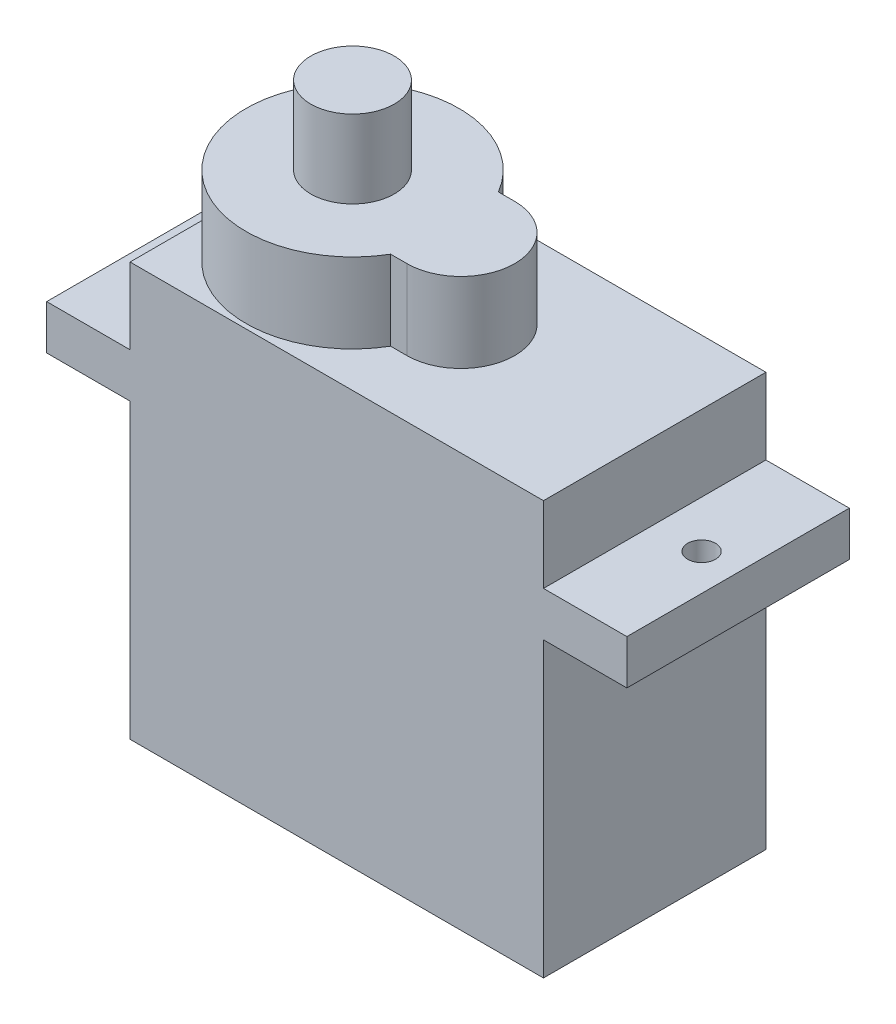
ISO-10303-21;
HEADER;
FILE_DESCRIPTION(('STEP AP214'),'2;1');
FILE_NAME('part.step','',(''),(''),'','','');
FILE_SCHEMA(('AUTOMOTIVE_DESIGN { 1 0 10303 214 1 1 1 1 }'));
ENDSEC;
DATA;
#1=APPLICATION_CONTEXT('core data for automotive mechanical design processes');
#2=APPLICATION_PROTOCOL_DEFINITION('international standard','automotive_design',2000,#1);
#3=PRODUCT_CONTEXT('',#1,'mechanical');
#4=PRODUCT('Part','Part','',(#3));
#5=PRODUCT_RELATED_PRODUCT_CATEGORY('part','',(#4));
#6=PRODUCT_DEFINITION_FORMATION('','',#4);
#7=PRODUCT_DEFINITION_CONTEXT('part definition',#1,'design');
#8=PRODUCT_DEFINITION('design','',#6,#7);
#9=PRODUCT_DEFINITION_SHAPE('','',#8);
#10=(LENGTH_UNIT() NAMED_UNIT(*) SI_UNIT(.MILLI.,.METRE.));
#11=(NAMED_UNIT(*) PLANE_ANGLE_UNIT() SI_UNIT($,.RADIAN.));
#12=(NAMED_UNIT(*) SI_UNIT($,.STERADIAN.) SOLID_ANGLE_UNIT());
#13=UNCERTAINTY_MEASURE_WITH_UNIT(LENGTH_MEASURE(1.E-05),#10,'distance_accuracy_value','');
#14=(GEOMETRIC_REPRESENTATION_CONTEXT(3) GLOBAL_UNCERTAINTY_ASSIGNED_CONTEXT((#13)) GLOBAL_UNIT_ASSIGNED_CONTEXT((#10,
#11,#12)) REPRESENTATION_CONTEXT('',''));
#15=CARTESIAN_POINT('',(0.,0.,0.));
#16=DIRECTION('',(0.,0.,1.));
#17=DIRECTION('',(1.,0.,0.));
#18=AXIS2_PLACEMENT_3D('',#15,#16,#17);
#19=CARTESIAN_POINT('',(11.15,22.3,-6.));
#20=DIRECTION('',(-1.,0.,0.));
#21=DIRECTION('',(0.,0.,1.));
#22=AXIS2_PLACEMENT_3D('',#19,#20,#21);
#23=PLANE('',#22);
#24=DIRECTION('',(0.,-1.,0.));
#25=VECTOR('',#24,1.);
#26=CARTESIAN_POINT('',(11.15,22.3,-6.));
#27=LINE('',#26,#25);
#28=CARTESIAN_POINT('',(11.15,15.8,-6.));
#29=VERTEX_POINT('',#28);
#30=CARTESIAN_POINT('',(11.15,0.,-6.));
#31=VERTEX_POINT('',#30);
#32=EDGE_CURVE('E256',#29,#31,#27,.T.);
#33=ORIENTED_EDGE('',*,*,#32,.F.);
#34=DIRECTION('',(0.,0.,1.));
#35=VECTOR('',#34,1.);
#36=CARTESIAN_POINT('',(11.15,15.8,-6.));
#37=LINE('',#36,#35);
#38=CARTESIAN_POINT('',(11.15,15.8,6.));
#39=VERTEX_POINT('',#38);
#40=EDGE_CURVE('E177',#29,#39,#37,.T.);
#41=ORIENTED_EDGE('',*,*,#40,.T.);
#42=DIRECTION('',(0.,-1.,0.));
#43=VECTOR('',#42,1.);
#44=CARTESIAN_POINT('',(11.15,22.3,6.));
#45=LINE('',#44,#43);
#46=CARTESIAN_POINT('',(11.15,0.,6.));
#47=VERTEX_POINT('',#46);
#48=EDGE_CURVE('E260',#39,#47,#45,.T.);
#49=ORIENTED_EDGE('',*,*,#48,.T.);
#50=DIRECTION('',(0.,0.,-1.));
#51=VECTOR('',#50,1.);
#52=CARTESIAN_POINT('',(11.15,0.,-6.));
#53=LINE('',#52,#51);
#54=EDGE_CURVE('E249',#47,#31,#53,.T.);
#55=ORIENTED_EDGE('',*,*,#54,.T.);
#56=EDGE_LOOP('',(#33,#41,#49,#55));
#57=FACE_BOUND('',#56,.T.);
#58=ADVANCED_FACE('F39',(#57),#23,.F.);
#59=CARTESIAN_POINT('',(-11.15,22.3,-6.));
#60=DIRECTION('',(1.,0.,0.));
#61=DIRECTION('',(0.,0.,-1.));
#62=AXIS2_PLACEMENT_3D('',#59,#60,#61);
#63=PLANE('',#62);
#64=DIRECTION('',(0.,0.,-1.));
#65=VECTOR('',#64,1.);
#66=CARTESIAN_POINT('',(-11.15,18.2,-6.));
#67=LINE('',#66,#65);
#68=CARTESIAN_POINT('',(-11.15,18.2,6.));
#69=VERTEX_POINT('',#68);
#70=CARTESIAN_POINT('',(-11.15,18.2,-6.));
#71=VERTEX_POINT('',#70);
#72=EDGE_CURVE('E210',#69,#71,#67,.T.);
#73=ORIENTED_EDGE('',*,*,#72,.F.);
#74=DIRECTION('',(0.,-1.,0.));
#75=VECTOR('',#74,1.);
#76=CARTESIAN_POINT('',(-11.15,22.3,6.));
#77=LINE('',#76,#75);
#78=CARTESIAN_POINT('',(-11.15,22.3,6.));
#79=VERTEX_POINT('',#78);
#80=EDGE_CURVE('E48',#79,#69,#77,.T.);
#81=ORIENTED_EDGE('',*,*,#80,.F.);
#82=DIRECTION('',(0.,0.,1.));
#83=VECTOR('',#82,1.);
#84=CARTESIAN_POINT('',(-11.15,22.3,-6.));
#85=LINE('',#84,#83);
#86=CARTESIAN_POINT('',(-11.15,22.3,-6.));
#87=VERTEX_POINT('',#86);
#88=EDGE_CURVE('E233',#87,#79,#85,.T.);
#89=ORIENTED_EDGE('',*,*,#88,.F.);
#90=DIRECTION('',(0.,-1.,0.));
#91=VECTOR('',#90,1.);
#92=CARTESIAN_POINT('',(-11.15,22.3,-6.));
#93=LINE('',#92,#91);
#94=EDGE_CURVE('E254',#87,#71,#93,.T.);
#95=ORIENTED_EDGE('',*,*,#94,.T.);
#96=EDGE_LOOP('',(#73,#81,#89,#95));
#97=FACE_BOUND('',#96,.T.);
#98=ADVANCED_FACE('F41',(#97),#63,.F.);
#99=DIRECTION('',(0.,0.,1.));
#100=VECTOR('',#99,1.);
#101=CARTESIAN_POINT('',(-11.15,15.8,-6.));
#102=LINE('',#101,#100);
#103=CARTESIAN_POINT('',(-11.15,15.8,-6.));
#104=VERTEX_POINT('',#103);
#105=CARTESIAN_POINT('',(-11.15,15.8,6.));
#106=VERTEX_POINT('',#105);
#107=EDGE_CURVE('E205',#104,#106,#102,.T.);
#108=ORIENTED_EDGE('',*,*,#107,.F.);
#109=CARTESIAN_POINT('',(-11.15,0.,-6.));
#110=VERTEX_POINT('',#109);
#111=EDGE_CURVE('E243',#104,#110,#93,.T.);
#112=ORIENTED_EDGE('',*,*,#111,.T.);
#113=DIRECTION('',(0.,0.,1.));
#114=VECTOR('',#113,1.);
#115=CARTESIAN_POINT('',(-11.15,0.,-6.));
#116=LINE('',#115,#114);
#117=CARTESIAN_POINT('',(-11.15,0.,6.));
#118=VERTEX_POINT('',#117);
#119=EDGE_CURVE('E232',#110,#118,#116,.T.);
#120=ORIENTED_EDGE('',*,*,#119,.T.);
#121=EDGE_CURVE('E263',#106,#118,#77,.T.);
#122=ORIENTED_EDGE('',*,*,#121,.F.);
#123=EDGE_LOOP('',(#108,#112,#120,#122));
#124=FACE_BOUND('',#123,.T.);
#125=ADVANCED_FACE('F279',(#124),#63,.F.);
#126=CARTESIAN_POINT('',(-11.15,22.3,6.));
#127=DIRECTION('',(0.,0.,-1.));
#128=DIRECTION('',(-1.,0.,0.));
#129=AXIS2_PLACEMENT_3D('',#126,#127,#128);
#130=PLANE('',#129);
#131=DIRECTION('',(1.,0.,0.));
#132=VECTOR('',#131,1.);
#133=CARTESIAN_POINT('',(-11.15,0.,6.));
#134=LINE('',#133,#132);
#135=EDGE_CURVE('E246',#118,#47,#134,.T.);
#136=ORIENTED_EDGE('',*,*,#135,.T.);
#137=ORIENTED_EDGE('',*,*,#48,.F.);
#138=DIRECTION('',(-1.,0.,0.));
#139=VECTOR('',#138,1.);
#140=CARTESIAN_POINT('',(15.65,15.8,6.));
#141=LINE('',#140,#139);
#142=CARTESIAN_POINT('',(15.65,15.8,6.));
#143=VERTEX_POINT('',#142);
#144=EDGE_CURVE('E199',#143,#39,#141,.T.);
#145=ORIENTED_EDGE('',*,*,#144,.F.);
#146=DIRECTION('',(0.,1.,0.));
#147=VECTOR('',#146,1.);
#148=CARTESIAN_POINT('',(15.65,18.2,6.));
#149=LINE('',#148,#147);
#150=CARTESIAN_POINT('',(15.65,18.2,6.));
#151=VERTEX_POINT('',#150);
#152=EDGE_CURVE('E189',#143,#151,#149,.T.);
#153=ORIENTED_EDGE('',*,*,#152,.T.);
#154=DIRECTION('',(-1.,0.,0.));
#155=VECTOR('',#154,1.);
#156=CARTESIAN_POINT('',(15.65,18.2,6.));
#157=LINE('',#156,#155);
#158=CARTESIAN_POINT('',(11.15,18.2,6.));
#159=VERTEX_POINT('',#158);
#160=EDGE_CURVE('E201',#151,#159,#157,.T.);
#161=ORIENTED_EDGE('',*,*,#160,.T.);
#162=CARTESIAN_POINT('',(11.15,22.3,6.));
#163=VERTEX_POINT('',#162);
#164=EDGE_CURVE('E261',#163,#159,#45,.T.);
#165=ORIENTED_EDGE('',*,*,#164,.F.);
#166=DIRECTION('',(1.,0.,0.));
#167=VECTOR('',#166,1.);
#168=CARTESIAN_POINT('',(-11.15,22.3,6.));
#169=LINE('',#168,#167);
#170=EDGE_CURVE('E236',#79,#163,#169,.T.);
#171=ORIENTED_EDGE('',*,*,#170,.F.);
#172=ORIENTED_EDGE('',*,*,#80,.T.);
#173=DIRECTION('',(1.,0.,0.));
#174=VECTOR('',#173,1.);
#175=CARTESIAN_POINT('',(-15.65,18.2,6.));
#176=LINE('',#175,#174);
#177=CARTESIAN_POINT('',(-15.65,18.2,6.));
#178=VERTEX_POINT('',#177);
#179=EDGE_CURVE('E223',#178,#69,#176,.T.);
#180=ORIENTED_EDGE('',*,*,#179,.F.);
#181=DIRECTION('',(0.,1.,0.));
#182=VECTOR('',#181,1.);
#183=CARTESIAN_POINT('',(-15.65,18.2,6.));
#184=LINE('',#183,#182);
#185=CARTESIAN_POINT('',(-15.65,15.8,6.));
#186=VERTEX_POINT('',#185);
#187=EDGE_CURVE('E212',#186,#178,#184,.T.);
#188=ORIENTED_EDGE('',*,*,#187,.F.);
#189=DIRECTION('',(1.,0.,0.));
#190=VECTOR('',#189,1.);
#191=CARTESIAN_POINT('',(-15.65,15.8,6.));
#192=LINE('',#191,#190);
#193=EDGE_CURVE('E226',#186,#106,#192,.T.);
#194=ORIENTED_EDGE('',*,*,#193,.T.);
#195=ORIENTED_EDGE('',*,*,#121,.T.);
#196=EDGE_LOOP('',(#136,#137,#145,#153,#161,#165,#171,#172,#180,#188,#194,#195));
#197=FACE_BOUND('',#196,.T.);
#198=ADVANCED_FACE('F269',(#197),#130,.F.);
#199=ORIENTED_EDGE('',*,*,#164,.T.);
#200=DIRECTION('',(0.,0.,-1.));
#201=VECTOR('',#200,1.);
#202=CARTESIAN_POINT('',(11.15,18.2,-6.));
#203=LINE('',#202,#201);
#204=CARTESIAN_POINT('',(11.15,18.2,-6.));
#205=VERTEX_POINT('',#204);
#206=EDGE_CURVE('E174',#159,#205,#203,.T.);
#207=ORIENTED_EDGE('',*,*,#206,.T.);
#208=CARTESIAN_POINT('',(11.15,22.3,-6.));
#209=VERTEX_POINT('',#208);
#210=EDGE_CURVE('E257',#209,#205,#27,.T.);
#211=ORIENTED_EDGE('',*,*,#210,.F.);
#212=DIRECTION('',(0.,0.,-1.));
#213=VECTOR('',#212,1.);
#214=CARTESIAN_POINT('',(11.15,22.3,-6.));
#215=LINE('',#214,#213);
#216=EDGE_CURVE('E239',#163,#209,#215,.T.);
#217=ORIENTED_EDGE('',*,*,#216,.F.);
#218=EDGE_LOOP('',(#199,#207,#211,#217));
#219=FACE_BOUND('',#218,.T.);
#220=ADVANCED_FACE('F302',(#219),#23,.F.);
#221=CARTESIAN_POINT('',(-11.15,22.3,-6.));
#222=DIRECTION('',(0.,0.,1.));
#223=DIRECTION('',(1.,0.,0.));
#224=AXIS2_PLACEMENT_3D('',#221,#222,#223);
#225=PLANE('',#224);
#226=DIRECTION('',(-1.,0.,0.));
#227=VECTOR('',#226,1.);
#228=CARTESIAN_POINT('',(-11.15,0.,-6.));
#229=LINE('',#228,#227);
#230=EDGE_CURVE('E237',#31,#110,#229,.T.);
#231=ORIENTED_EDGE('',*,*,#230,.T.);
#232=ORIENTED_EDGE('',*,*,#111,.F.);
#233=DIRECTION('',(1.,0.,0.));
#234=VECTOR('',#233,1.);
#235=CARTESIAN_POINT('',(-15.65,15.8,-6.));
#236=LINE('',#235,#234);
#237=CARTESIAN_POINT('',(-15.65,15.8,-6.));
#238=VERTEX_POINT('',#237);
#239=EDGE_CURVE('E229',#238,#104,#236,.T.);
#240=ORIENTED_EDGE('',*,*,#239,.F.);
#241=DIRECTION('',(0.,-1.,0.));
#242=VECTOR('',#241,1.);
#243=CARTESIAN_POINT('',(-15.65,18.2,-6.));
#244=LINE('',#243,#242);
#245=CARTESIAN_POINT('',(-15.65,18.2,-6.));
#246=VERTEX_POINT('',#245);
#247=EDGE_CURVE('E206',#246,#238,#244,.T.);
#248=ORIENTED_EDGE('',*,*,#247,.F.);
#249=DIRECTION('',(1.,0.,0.));
#250=VECTOR('',#249,1.);
#251=CARTESIAN_POINT('',(-15.65,18.2,-6.));
#252=LINE('',#251,#250);
#253=EDGE_CURVE('E216',#246,#71,#252,.T.);
#254=ORIENTED_EDGE('',*,*,#253,.T.);
#255=ORIENTED_EDGE('',*,*,#94,.F.);
#256=DIRECTION('',(-1.,0.,0.));
#257=VECTOR('',#256,1.);
#258=CARTESIAN_POINT('',(-11.15,22.3,-6.));
#259=LINE('',#258,#257);
#260=EDGE_CURVE('E241',#209,#87,#259,.T.);
#261=ORIENTED_EDGE('',*,*,#260,.F.);
#262=ORIENTED_EDGE('',*,*,#210,.T.);
#263=DIRECTION('',(-1.,0.,0.));
#264=VECTOR('',#263,1.);
#265=CARTESIAN_POINT('',(15.65,18.2,-6.));
#266=LINE('',#265,#264);
#267=CARTESIAN_POINT('',(15.65,18.2,-6.));
#268=VERTEX_POINT('',#267);
#269=EDGE_CURVE('E203',#268,#205,#266,.T.);
#270=ORIENTED_EDGE('',*,*,#269,.F.);
#271=DIRECTION('',(0.,-1.,0.));
#272=VECTOR('',#271,1.);
#273=CARTESIAN_POINT('',(15.65,18.2,-6.));
#274=LINE('',#273,#272);
#275=CARTESIAN_POINT('',(15.65,15.8,-6.));
#276=VERTEX_POINT('',#275);
#277=EDGE_CURVE('E183',#268,#276,#274,.T.);
#278=ORIENTED_EDGE('',*,*,#277,.T.);
#279=DIRECTION('',(-1.,0.,0.));
#280=VECTOR('',#279,1.);
#281=CARTESIAN_POINT('',(15.65,15.8,-6.));
#282=LINE('',#281,#280);
#283=EDGE_CURVE('E194',#276,#29,#282,.T.);
#284=ORIENTED_EDGE('',*,*,#283,.T.);
#285=ORIENTED_EDGE('',*,*,#32,.T.);
#286=EDGE_LOOP('',(#231,#232,#240,#248,#254,#255,#261,#262,#270,#278,#284,#285));
#287=FACE_BOUND('',#286,.T.);
#288=ADVANCED_FACE('F283',(#287),#225,.F.);
#289=CARTESIAN_POINT('',(0.,22.3,0.));
#290=DIRECTION('',(0.,1.,0.));
#291=DIRECTION('',(0.,0.,1.));
#292=AXIS2_PLACEMENT_3D('',#289,#290,#291);
#293=PLANE('',#292);
#294=CARTESIAN_POINT('',(-5.15,22.3,0.));
#295=DIRECTION('',(0.,1.,0.));
#296=DIRECTION('',(0.,0.,-1.));
#297=AXIS2_PLACEMENT_3D('',#294,#295,#296);
#298=CIRCLE('',#297,5.75);
#299=CARTESIAN_POINT('',(-0.188814245563435,22.3,-2.90673973894735));
#300=VERTEX_POINT('',#299);
#301=CARTESIAN_POINT('',(-0.188814245563435,22.3,2.90673973894735));
#302=VERTEX_POINT('',#301);
#303=EDGE_CURVE('E56',#300,#302,#298,.T.);
#304=ORIENTED_EDGE('',*,*,#303,.F.);
#305=DIRECTION('',(-1.,0.,0.));
#306=VECTOR('',#305,1.);
#307=CARTESIAN_POINT('',(0.693260261052688,22.3,-2.90673973894735));
#308=LINE('',#307,#306);
#309=CARTESIAN_POINT('',(0.693260261052689,22.3,-2.90673973894735));
#310=VERTEX_POINT('',#309);
#311=EDGE_CURVE('E60',#310,#300,#308,.T.);
#312=ORIENTED_EDGE('',*,*,#311,.F.);
#313=CARTESIAN_POINT('',(0.693260261052657,22.3,0.));
#314=DIRECTION('',(0.,1.,0.));
#315=DIRECTION('',(0.,0.,1.));
#316=AXIS2_PLACEMENT_3D('',#313,#314,#315);
#317=CIRCLE('',#316,2.90673973894735);
#318=CARTESIAN_POINT('',(0.693260261052647,22.3,2.90673973894735));
#319=VERTEX_POINT('',#318);
#320=EDGE_CURVE('E513',#319,#310,#317,.T.);
#321=ORIENTED_EDGE('',*,*,#320,.F.);
#322=DIRECTION('',(1.,0.,0.));
#323=VECTOR('',#322,1.);
#324=CARTESIAN_POINT('',(-0.188814245563435,22.3,2.90673973894735));
#325=LINE('',#324,#323);
#326=EDGE_CURVE('E511',#302,#319,#325,.T.);
#327=ORIENTED_EDGE('',*,*,#326,.F.);
#328=EDGE_LOOP('',(#304,#312,#321,#327));
#329=FACE_BOUND('',#328,.T.);
#330=ORIENTED_EDGE('',*,*,#88,.T.);
#331=ORIENTED_EDGE('',*,*,#170,.T.);
#332=ORIENTED_EDGE('',*,*,#216,.T.);
#333=ORIENTED_EDGE('',*,*,#260,.T.);
#334=EDGE_LOOP('',(#330,#331,#332,#333));
#335=FACE_BOUND('',#334,.T.);
#336=ADVANCED_FACE('F305',(#329,#335),#293,.T.);
#337=CARTESIAN_POINT('',(0.,0.,0.));
#338=DIRECTION('',(0.,1.,0.));
#339=DIRECTION('',(0.,0.,1.));
#340=AXIS2_PLACEMENT_3D('',#337,#338,#339);
#341=PLANE('',#340);
#342=ORIENTED_EDGE('',*,*,#119,.F.);
#343=ORIENTED_EDGE('',*,*,#230,.F.);
#344=ORIENTED_EDGE('',*,*,#54,.F.);
#345=ORIENTED_EDGE('',*,*,#135,.F.);
#346=EDGE_LOOP('',(#342,#343,#344,#345));
#347=FACE_BOUND('',#346,.T.);
#348=ADVANCED_FACE('F277',(#347),#341,.F.);
#349=CARTESIAN_POINT('',(-15.65,15.8,-6.));
#350=DIRECTION('',(0.,1.,0.));
#351=DIRECTION('',(0.,0.,1.));
#352=AXIS2_PLACEMENT_3D('',#349,#350,#351);
#353=PLANE('',#352);
#354=CARTESIAN_POINT('',(-13.68,15.8,0.));
#355=DIRECTION('',(0.,1.,0.));
#356=DIRECTION('',(0.,0.,1.));
#357=AXIS2_PLACEMENT_3D('',#354,#355,#356);
#358=CIRCLE('',#357,0.75);
#359=CARTESIAN_POINT('',(-13.68,15.8,0.75));
#360=VERTEX_POINT('',#359);
#361=EDGE_CURVE('E505',#360,#360,#358,.T.);
#362=ORIENTED_EDGE('',*,*,#361,.T.);
#363=EDGE_LOOP('',(#362));
#364=FACE_BOUND('',#363,.T.);
#365=ORIENTED_EDGE('',*,*,#107,.T.);
#366=ORIENTED_EDGE('',*,*,#193,.F.);
#367=DIRECTION('',(0.,0.,1.));
#368=VECTOR('',#367,1.);
#369=CARTESIAN_POINT('',(-15.65,15.8,-6.));
#370=LINE('',#369,#368);
#371=EDGE_CURVE('E209',#238,#186,#370,.T.);
#372=ORIENTED_EDGE('',*,*,#371,.F.);
#373=ORIENTED_EDGE('',*,*,#239,.T.);
#374=EDGE_LOOP('',(#365,#366,#372,#373));
#375=FACE_BOUND('',#374,.T.);
#376=ADVANCED_FACE('F317',(#364,#375),#353,.F.);
#377=CARTESIAN_POINT('',(-15.65,18.2,-6.));
#378=DIRECTION('',(0.,-1.,0.));
#379=DIRECTION('',(0.,0.,-1.));
#380=AXIS2_PLACEMENT_3D('',#377,#378,#379);
#381=PLANE('',#380);
#382=CARTESIAN_POINT('',(-13.68,18.2,0.));
#383=DIRECTION('',(0.,1.,0.));
#384=DIRECTION('',(0.,0.,1.));
#385=AXIS2_PLACEMENT_3D('',#382,#383,#384);
#386=CIRCLE('',#385,0.75);
#387=CARTESIAN_POINT('',(-13.68,18.2,0.75));
#388=VERTEX_POINT('',#387);
#389=EDGE_CURVE('E500',#388,#388,#386,.T.);
#390=ORIENTED_EDGE('',*,*,#389,.F.);
#391=EDGE_LOOP('',(#390));
#392=FACE_BOUND('',#391,.T.);
#393=ORIENTED_EDGE('',*,*,#72,.T.);
#394=ORIENTED_EDGE('',*,*,#253,.F.);
#395=DIRECTION('',(0.,0.,-1.));
#396=VECTOR('',#395,1.);
#397=CARTESIAN_POINT('',(-15.65,18.2,-6.));
#398=LINE('',#397,#396);
#399=EDGE_CURVE('E214',#178,#246,#398,.T.);
#400=ORIENTED_EDGE('',*,*,#399,.F.);
#401=ORIENTED_EDGE('',*,*,#179,.T.);
#402=EDGE_LOOP('',(#393,#394,#400,#401));
#403=FACE_BOUND('',#402,.T.);
#404=ADVANCED_FACE('F311',(#392,#403),#381,.F.);
#405=CARTESIAN_POINT('',(-15.65,0.,0.));
#406=DIRECTION('',(-1.,0.,0.));
#407=DIRECTION('',(0.,0.,1.));
#408=AXIS2_PLACEMENT_3D('',#405,#406,#407);
#409=PLANE('',#408);
#410=ORIENTED_EDGE('',*,*,#247,.T.);
#411=ORIENTED_EDGE('',*,*,#371,.T.);
#412=ORIENTED_EDGE('',*,*,#187,.T.);
#413=ORIENTED_EDGE('',*,*,#399,.T.);
#414=EDGE_LOOP('',(#410,#411,#412,#413));
#415=FACE_BOUND('',#414,.T.);
#416=ADVANCED_FACE('F315',(#415),#409,.T.);
#417=CARTESIAN_POINT('',(15.65,18.2,-6.));
#418=DIRECTION('',(0.,1.,0.));
#419=DIRECTION('',(0.,0.,1.));
#420=AXIS2_PLACEMENT_3D('',#417,#418,#419);
#421=PLANE('',#420);
#422=CARTESIAN_POINT('',(13.68,18.2,0.));
#423=DIRECTION('',(0.,1.,0.));
#424=DIRECTION('',(0.,0.,1.));
#425=AXIS2_PLACEMENT_3D('',#422,#423,#424);
#426=CIRCLE('',#425,0.75);
#427=CARTESIAN_POINT('',(13.68,18.2,0.749999999999995));
#428=VERTEX_POINT('',#427);
#429=EDGE_CURVE('E497',#428,#428,#426,.T.);
#430=ORIENTED_EDGE('',*,*,#429,.F.);
#431=EDGE_LOOP('',(#430));
#432=FACE_BOUND('',#431,.T.);
#433=ORIENTED_EDGE('',*,*,#206,.F.);
#434=ORIENTED_EDGE('',*,*,#160,.F.);
#435=DIRECTION('',(0.,0.,-1.));
#436=VECTOR('',#435,1.);
#437=CARTESIAN_POINT('',(15.65,18.2,-6.));
#438=LINE('',#437,#436);
#439=EDGE_CURVE('E186',#151,#268,#438,.T.);
#440=ORIENTED_EDGE('',*,*,#439,.T.);
#441=ORIENTED_EDGE('',*,*,#269,.T.);
#442=EDGE_LOOP('',(#433,#434,#440,#441));
#443=FACE_BOUND('',#442,.T.);
#444=ADVANCED_FACE('F297',(#432,#443),#421,.T.);
#445=CARTESIAN_POINT('',(15.65,15.8,-6.));
#446=DIRECTION('',(0.,-1.,0.));
#447=DIRECTION('',(0.,0.,-1.));
#448=AXIS2_PLACEMENT_3D('',#445,#446,#447);
#449=PLANE('',#448);
#450=CARTESIAN_POINT('',(13.68,15.8,0.));
#451=DIRECTION('',(0.,-1.,0.));
#452=DIRECTION('',(0.,0.,-1.));
#453=AXIS2_PLACEMENT_3D('',#450,#451,#452);
#454=CIRCLE('',#453,0.75);
#455=CARTESIAN_POINT('',(13.68,15.8,-0.750000000000005));
#456=VERTEX_POINT('',#455);
#457=EDGE_CURVE('E43',#456,#456,#454,.T.);
#458=ORIENTED_EDGE('',*,*,#457,.F.);
#459=EDGE_LOOP('',(#458));
#460=FACE_BOUND('',#459,.T.);
#461=ORIENTED_EDGE('',*,*,#40,.F.);
#462=ORIENTED_EDGE('',*,*,#283,.F.);
#463=DIRECTION('',(0.,0.,1.));
#464=VECTOR('',#463,1.);
#465=CARTESIAN_POINT('',(15.65,15.8,-6.));
#466=LINE('',#465,#464);
#467=EDGE_CURVE('E192',#276,#143,#466,.T.);
#468=ORIENTED_EDGE('',*,*,#467,.T.);
#469=ORIENTED_EDGE('',*,*,#144,.T.);
#470=EDGE_LOOP('',(#461,#462,#468,#469));
#471=FACE_BOUND('',#470,.T.);
#472=ADVANCED_FACE('F294',(#460,#471),#449,.T.);
#473=CARTESIAN_POINT('',(15.65,0.,0.));
#474=DIRECTION('',(1.,0.,0.));
#475=DIRECTION('',(0.,0.,1.));
#476=AXIS2_PLACEMENT_3D('',#473,#474,#475);
#477=PLANE('',#476);
#478=ORIENTED_EDGE('',*,*,#277,.F.);
#479=ORIENTED_EDGE('',*,*,#439,.F.);
#480=ORIENTED_EDGE('',*,*,#152,.F.);
#481=ORIENTED_EDGE('',*,*,#467,.F.);
#482=EDGE_LOOP('',(#478,#479,#480,#481));
#483=FACE_BOUND('',#482,.T.);
#484=ADVANCED_FACE('F293',(#483),#477,.T.);
#485=CARTESIAN_POINT('',(-5.15,26.6,0.));
#486=DIRECTION('',(0.,-1.,0.));
#487=DIRECTION('',(0.,0.,-1.));
#488=AXIS2_PLACEMENT_3D('',#485,#486,#487);
#489=CYLINDRICAL_SURFACE('',#488,5.75);
#490=ORIENTED_EDGE('',*,*,#303,.T.);
#491=DIRECTION('',(0.,-1.,0.));
#492=VECTOR('',#491,1.);
#493=CARTESIAN_POINT('',(-0.188814245563435,26.6,2.90673973894735));
#494=LINE('',#493,#492);
#495=CARTESIAN_POINT('',(-0.188814245563435,26.6,2.90673973894735));
#496=VERTEX_POINT('',#495);
#497=EDGE_CURVE('E157',#496,#302,#494,.T.);
#498=ORIENTED_EDGE('',*,*,#497,.F.);
#499=CARTESIAN_POINT('',(-5.15,26.6,0.));
#500=DIRECTION('',(0.,1.,0.));
#501=DIRECTION('',(0.,0.,-1.));
#502=AXIS2_PLACEMENT_3D('',#499,#500,#501);
#503=CIRCLE('',#502,5.75);
#504=CARTESIAN_POINT('',(-0.188814245563435,26.6,-2.90673973894735));
#505=VERTEX_POINT('',#504);
#506=EDGE_CURVE('E163',#505,#496,#503,.T.);
#507=ORIENTED_EDGE('',*,*,#506,.F.);
#508=DIRECTION('',(0.,-1.,0.));
#509=VECTOR('',#508,1.);
#510=CARTESIAN_POINT('',(-0.188814245563435,26.6,-2.90673973894735));
#511=LINE('',#510,#509);
#512=EDGE_CURVE('E509',#505,#300,#511,.T.);
#513=ORIENTED_EDGE('',*,*,#512,.T.);
#514=EDGE_LOOP('',(#490,#498,#507,#513));
#515=FACE_BOUND('',#514,.T.);
#516=ADVANCED_FACE('F173',(#515),#489,.T.);
#517=CARTESIAN_POINT('',(-0.188814245563435,26.6,2.90673973894735));
#518=DIRECTION('',(0.,0.,-1.));
#519=DIRECTION('',(-1.,0.,0.));
#520=AXIS2_PLACEMENT_3D('',#517,#518,#519);
#521=PLANE('',#520);
#522=ORIENTED_EDGE('',*,*,#326,.T.);
#523=DIRECTION('',(0.,-1.,0.));
#524=VECTOR('',#523,1.);
#525=CARTESIAN_POINT('',(0.693260261052647,26.6,2.90673973894735));
#526=LINE('',#525,#524);
#527=CARTESIAN_POINT('',(0.693260261052647,26.6,2.90673973894735));
#528=VERTEX_POINT('',#527);
#529=EDGE_CURVE('E159',#528,#319,#526,.T.);
#530=ORIENTED_EDGE('',*,*,#529,.F.);
#531=DIRECTION('',(1.,0.,0.));
#532=VECTOR('',#531,1.);
#533=CARTESIAN_POINT('',(-0.188814245563435,26.6,2.90673973894735));
#534=LINE('',#533,#532);
#535=EDGE_CURVE('E152',#496,#528,#534,.T.);
#536=ORIENTED_EDGE('',*,*,#535,.F.);
#537=ORIENTED_EDGE('',*,*,#497,.T.);
#538=EDGE_LOOP('',(#522,#530,#536,#537));
#539=FACE_BOUND('',#538,.T.);
#540=ADVANCED_FACE('F155',(#539),#521,.F.);
#541=CARTESIAN_POINT('',(0.693260261052657,26.6,0.));
#542=DIRECTION('',(0.,-1.,0.));
#543=DIRECTION('',(0.,0.,-1.));
#544=AXIS2_PLACEMENT_3D('',#541,#542,#543);
#545=CYLINDRICAL_SURFACE('',#544,2.90673973894735);
#546=ORIENTED_EDGE('',*,*,#320,.T.);
#547=DIRECTION('',(0.,-1.,0.));
#548=VECTOR('',#547,1.);
#549=CARTESIAN_POINT('',(0.693260261052689,26.6,-2.90673973894735));
#550=LINE('',#549,#548);
#551=CARTESIAN_POINT('',(0.693260261052689,26.6,-2.90673973894735));
#552=VERTEX_POINT('',#551);
#553=EDGE_CURVE('E179',#552,#310,#550,.T.);
#554=ORIENTED_EDGE('',*,*,#553,.F.);
#555=CARTESIAN_POINT('',(0.693260261052657,26.6,0.));
#556=DIRECTION('',(0.,1.,0.));
#557=DIRECTION('',(0.,0.,1.));
#558=AXIS2_PLACEMENT_3D('',#555,#556,#557);
#559=CIRCLE('',#558,2.90673973894735);
#560=EDGE_CURVE('E162',#528,#552,#559,.T.);
#561=ORIENTED_EDGE('',*,*,#560,.F.);
#562=ORIENTED_EDGE('',*,*,#529,.T.);
#563=EDGE_LOOP('',(#546,#554,#561,#562));
#564=FACE_BOUND('',#563,.T.);
#565=ADVANCED_FACE('F425',(#564),#545,.T.);
#566=CARTESIAN_POINT('',(0.693260261052688,26.6,-2.90673973894735));
#567=DIRECTION('',(0.,0.,1.));
#568=DIRECTION('',(1.,0.,0.));
#569=AXIS2_PLACEMENT_3D('',#566,#567,#568);
#570=PLANE('',#569);
#571=ORIENTED_EDGE('',*,*,#311,.T.);
#572=ORIENTED_EDGE('',*,*,#512,.F.);
#573=DIRECTION('',(-1.,0.,0.));
#574=VECTOR('',#573,1.);
#575=CARTESIAN_POINT('',(0.693260261052688,26.6,-2.90673973894735));
#576=LINE('',#575,#574);
#577=EDGE_CURVE('E168',#552,#505,#576,.T.);
#578=ORIENTED_EDGE('',*,*,#577,.F.);
#579=ORIENTED_EDGE('',*,*,#553,.T.);
#580=EDGE_LOOP('',(#571,#572,#578,#579));
#581=FACE_BOUND('',#580,.T.);
#582=ADVANCED_FACE('F434',(#581),#570,.F.);
#583=CARTESIAN_POINT('',(-5.15,26.6,0.));
#584=DIRECTION('',(0.,-1.,0.));
#585=DIRECTION('',(0.,0.,-1.));
#586=AXIS2_PLACEMENT_3D('',#583,#584,#585);
#587=PLANE('',#586);
#588=CARTESIAN_POINT('',(-5.15,26.6,0.));
#589=DIRECTION('',(0.,1.,0.));
#590=DIRECTION('',(0.,0.,1.));
#591=AXIS2_PLACEMENT_3D('',#588,#589,#590);
#592=CIRCLE('',#591,2.25);
#593=CARTESIAN_POINT('',(-5.15,26.6,2.25));
#594=VERTEX_POINT('',#593);
#595=EDGE_CURVE('E11',#594,#594,#592,.T.);
#596=ORIENTED_EDGE('',*,*,#595,.F.);
#597=EDGE_LOOP('',(#596));
#598=FACE_BOUND('',#597,.T.);
#599=ORIENTED_EDGE('',*,*,#506,.T.);
#600=ORIENTED_EDGE('',*,*,#535,.T.);
#601=ORIENTED_EDGE('',*,*,#560,.T.);
#602=ORIENTED_EDGE('',*,*,#577,.T.);
#603=EDGE_LOOP('',(#599,#600,#601,#602));
#604=FACE_BOUND('',#603,.T.);
#605=ADVANCED_FACE('F166',(#598,#604),#587,.F.);
#606=CARTESIAN_POINT('',(13.68,8.2,0.));
#607=DIRECTION('',(0.,1.,0.));
#608=DIRECTION('',(0.,0.,1.));
#609=AXIS2_PLACEMENT_3D('',#606,#607,#608);
#610=CYLINDRICAL_SURFACE('',#609,0.75);
#611=ORIENTED_EDGE('',*,*,#457,.T.);
#612=EDGE_LOOP('',(#611));
#613=FACE_BOUND('',#612,.T.);
#614=ORIENTED_EDGE('',*,*,#429,.T.);
#615=EDGE_LOOP('',(#614));
#616=FACE_BOUND('',#615,.T.);
#617=ADVANCED_FACE('F452',(#613,#616),#610,.F.);
#618=CARTESIAN_POINT('',(-13.68,8.2,0.));
#619=DIRECTION('',(0.,1.,0.));
#620=DIRECTION('',(0.,0.,1.));
#621=AXIS2_PLACEMENT_3D('',#618,#619,#620);
#622=CYLINDRICAL_SURFACE('',#621,0.75);
#623=ORIENTED_EDGE('',*,*,#389,.T.);
#624=EDGE_LOOP('',(#623));
#625=FACE_BOUND('',#624,.T.);
#626=ORIENTED_EDGE('',*,*,#361,.F.);
#627=EDGE_LOOP('',(#626));
#628=FACE_BOUND('',#627,.T.);
#629=ADVANCED_FACE('F463',(#625,#628),#622,.F.);
#630=CARTESIAN_POINT('',(-5.15,30.8,0.));
#631=DIRECTION('',(0.,-1.,0.));
#632=DIRECTION('',(0.,0.,-1.));
#633=AXIS2_PLACEMENT_3D('',#630,#631,#632);
#634=CYLINDRICAL_SURFACE('',#633,2.25);
#635=CARTESIAN_POINT('',(-5.15,30.8,0.));
#636=DIRECTION('',(0.,1.,0.));
#637=DIRECTION('',(0.,0.,1.));
#638=AXIS2_PLACEMENT_3D('',#635,#636,#637);
#639=CIRCLE('',#638,2.25);
#640=CARTESIAN_POINT('',(-5.15,30.8,2.25));
#641=VERTEX_POINT('',#640);
#642=EDGE_CURVE('E496',#641,#641,#639,.T.);
#643=ORIENTED_EDGE('',*,*,#642,.F.);
#644=EDGE_LOOP('',(#643));
#645=FACE_BOUND('',#644,.T.);
#646=ORIENTED_EDGE('',*,*,#595,.T.);
#647=EDGE_LOOP('',(#646));
#648=FACE_BOUND('',#647,.T.);
#649=ADVANCED_FACE('F472',(#645,#648),#634,.T.);
#650=CARTESIAN_POINT('',(-5.15,30.8,0.));
#651=DIRECTION('',(0.,1.,0.));
#652=DIRECTION('',(0.,0.,1.));
#653=AXIS2_PLACEMENT_3D('',#650,#651,#652);
#654=PLANE('',#653);
#655=ORIENTED_EDGE('',*,*,#642,.T.);
#656=EDGE_LOOP('',(#655));
#657=FACE_BOUND('',#656,.T.);
#658=ADVANCED_FACE('F481',(#657),#654,.T.);
#659=CLOSED_SHELL('',(#58,#98,#125,#198,#220,#288,#336,#348,#376,#404,#416,#444,#472,#484,#516,
#540,#565,#582,#605,#617,#629,#649,#658));
#660=MANIFOLD_SOLID_BREP('B2',#659);
#661=ADVANCED_BREP_SHAPE_REPRESENTATION('',(#18,#660),#14);
#662=SHAPE_DEFINITION_REPRESENTATION(#9,#661);
ENDSEC;
END-ISO-10303-21;
